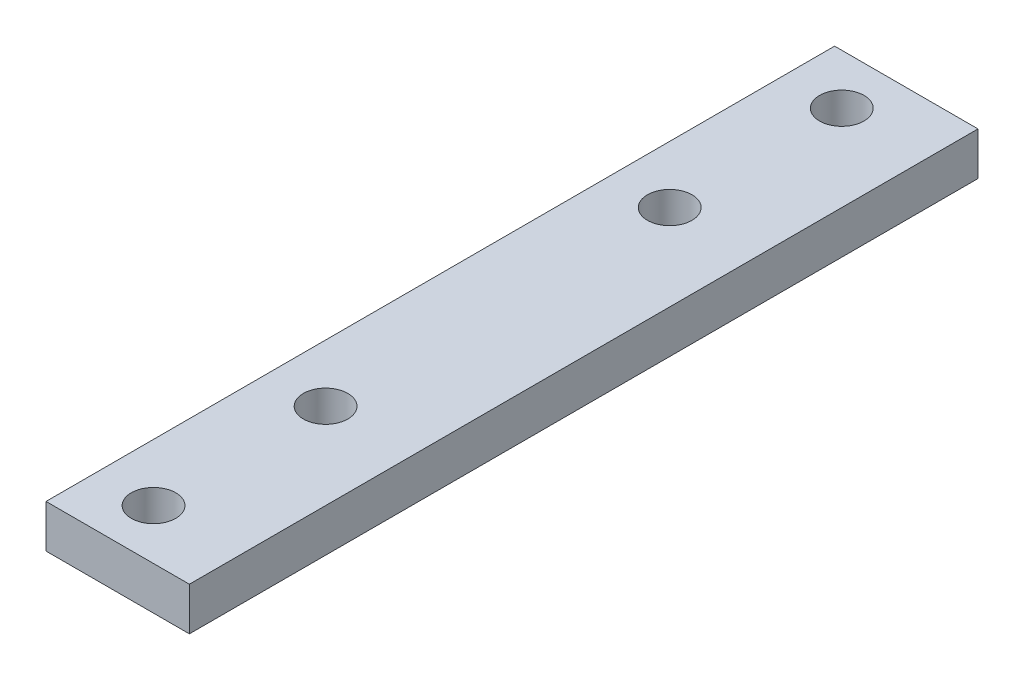
ISO-10303-21;
HEADER;
FILE_DESCRIPTION(('STEP AP214'),'2;1');
FILE_NAME('part.step','',(''),(''),'','','');
FILE_SCHEMA(('AUTOMOTIVE_DESIGN { 1 0 10303 214 1 1 1 1 }'));
ENDSEC;
DATA;
#1=APPLICATION_CONTEXT('core data for automotive mechanical design processes');
#2=APPLICATION_PROTOCOL_DEFINITION('international standard','automotive_design',2000,#1);
#3=PRODUCT_CONTEXT('',#1,'mechanical');
#4=PRODUCT('Part','Part','',(#3));
#5=PRODUCT_RELATED_PRODUCT_CATEGORY('part','',(#4));
#6=PRODUCT_DEFINITION_FORMATION('','',#4);
#7=PRODUCT_DEFINITION_CONTEXT('part definition',#1,'design');
#8=PRODUCT_DEFINITION('design','',#6,#7);
#9=PRODUCT_DEFINITION_SHAPE('','',#8);
#10=(LENGTH_UNIT() NAMED_UNIT(*) SI_UNIT(.MILLI.,.METRE.));
#11=(NAMED_UNIT(*) PLANE_ANGLE_UNIT() SI_UNIT($,.RADIAN.));
#12=(NAMED_UNIT(*) SI_UNIT($,.STERADIAN.) SOLID_ANGLE_UNIT());
#13=UNCERTAINTY_MEASURE_WITH_UNIT(LENGTH_MEASURE(1.E-05),#10,'distance_accuracy_value','');
#14=(GEOMETRIC_REPRESENTATION_CONTEXT(3) GLOBAL_UNCERTAINTY_ASSIGNED_CONTEXT((#13)) GLOBAL_UNIT_ASSIGNED_CONTEXT((#10,
#11,#12)) REPRESENTATION_CONTEXT('',''));
#15=CARTESIAN_POINT('',(0.,0.,0.));
#16=DIRECTION('',(0.,0.,1.));
#17=DIRECTION('',(1.,0.,0.));
#18=AXIS2_PLACEMENT_3D('',#15,#16,#17);
#19=CARTESIAN_POINT('',(-30.,0.,45.));
#20=DIRECTION('',(1.,0.,0.));
#21=DIRECTION('',(0.,1.,0.));
#22=AXIS2_PLACEMENT_3D('',#19,#20,#21);
#23=PLANE('',#22);
#24=DIRECTION('',(0.,1.,0.));
#25=VECTOR('',#24,1.);
#26=CARTESIAN_POINT('',(-30.,0.,-5.));
#27=LINE('',#26,#25);
#28=CARTESIAN_POINT('',(-30.,0.,-5.));
#29=VERTEX_POINT('',#28);
#30=CARTESIAN_POINT('',(-30.,3.,-5.));
#31=VERTEX_POINT('',#30);
#32=EDGE_CURVE('E11',#29,#31,#27,.T.);
#33=ORIENTED_EDGE('',*,*,#32,.F.);
#34=DIRECTION('',(0.,0.,-1.));
#35=VECTOR('',#34,1.);
#36=CARTESIAN_POINT('',(-30.,0.,0.));
#37=LINE('',#36,#35);
#38=CARTESIAN_POINT('',(-30.,0.,50.));
#39=VERTEX_POINT('',#38);
#40=EDGE_CURVE('E91',#39,#29,#37,.T.);
#41=ORIENTED_EDGE('',*,*,#40,.F.);
#42=DIRECTION('',(0.,1.,0.));
#43=VECTOR('',#42,1.);
#44=CARTESIAN_POINT('',(-30.,0.,50.));
#45=LINE('',#44,#43);
#46=CARTESIAN_POINT('',(-30.,3.,50.));
#47=VERTEX_POINT('',#46);
#48=EDGE_CURVE('E55',#39,#47,#45,.T.);
#49=ORIENTED_EDGE('',*,*,#48,.T.);
#50=DIRECTION('',(0.,0.,1.));
#51=VECTOR('',#50,1.);
#52=CARTESIAN_POINT('',(-30.,3.,-5.));
#53=LINE('',#52,#51);
#54=EDGE_CURVE('E107',#31,#47,#53,.T.);
#55=ORIENTED_EDGE('',*,*,#54,.F.);
#56=EDGE_LOOP('',(#33,#41,#49,#55));
#57=FACE_BOUND('',#56,.T.);
#58=ADVANCED_FACE('F47',(#57),#23,.F.);
#59=CARTESIAN_POINT('',(0.,0.,-5.));
#60=DIRECTION('',(0.,0.,-1.));
#61=DIRECTION('',(-1.,0.,0.));
#62=AXIS2_PLACEMENT_3D('',#59,#60,#61);
#63=PLANE('',#62);
#64=DIRECTION('',(0.,-1.,0.));
#65=VECTOR('',#64,1.);
#66=CARTESIAN_POINT('',(-20.,3.,-5.));
#67=LINE('',#66,#65);
#68=CARTESIAN_POINT('',(-20.,3.,-5.));
#69=VERTEX_POINT('',#68);
#70=CARTESIAN_POINT('',(-20.,0.,-5.));
#71=VERTEX_POINT('',#70);
#72=EDGE_CURVE('E120',#69,#71,#67,.T.);
#73=ORIENTED_EDGE('',*,*,#72,.T.);
#74=DIRECTION('',(1.,0.,0.));
#75=VECTOR('',#74,1.);
#76=CARTESIAN_POINT('',(-30.,0.,-5.));
#77=LINE('',#76,#75);
#78=EDGE_CURVE('E100',#29,#71,#77,.T.);
#79=ORIENTED_EDGE('',*,*,#78,.F.);
#80=ORIENTED_EDGE('',*,*,#32,.T.);
#81=DIRECTION('',(-1.,0.,0.));
#82=VECTOR('',#81,1.);
#83=CARTESIAN_POINT('',(-30.,3.,-5.));
#84=LINE('',#83,#82);
#85=EDGE_CURVE('E117',#69,#31,#84,.T.);
#86=ORIENTED_EDGE('',*,*,#85,.F.);
#87=EDGE_LOOP('',(#73,#79,#80,#86));
#88=FACE_BOUND('',#87,.T.);
#89=ADVANCED_FACE('F162',(#88),#63,.T.);
#90=CARTESIAN_POINT('',(0.,0.,50.));
#91=DIRECTION('',(0.,0.,1.));
#92=DIRECTION('',(-1.,0.,0.));
#93=AXIS2_PLACEMENT_3D('',#90,#91,#92);
#94=PLANE('',#93);
#95=ORIENTED_EDGE('',*,*,#48,.F.);
#96=DIRECTION('',(1.,0.,0.));
#97=VECTOR('',#96,1.);
#98=CARTESIAN_POINT('',(-30.,0.,50.));
#99=LINE('',#98,#97);
#100=CARTESIAN_POINT('',(-20.,0.,50.));
#101=VERTEX_POINT('',#100);
#102=EDGE_CURVE('E88',#39,#101,#99,.T.);
#103=ORIENTED_EDGE('',*,*,#102,.T.);
#104=DIRECTION('',(0.,-1.,0.));
#105=VECTOR('',#104,1.);
#106=CARTESIAN_POINT('',(-20.,3.,50.));
#107=LINE('',#106,#105);
#108=CARTESIAN_POINT('',(-20.,3.,50.));
#109=VERTEX_POINT('',#108);
#110=EDGE_CURVE('E125',#109,#101,#107,.T.);
#111=ORIENTED_EDGE('',*,*,#110,.F.);
#112=DIRECTION('',(1.,0.,0.));
#113=VECTOR('',#112,1.);
#114=CARTESIAN_POINT('',(-30.,3.,50.));
#115=LINE('',#114,#113);
#116=EDGE_CURVE('E103',#47,#109,#115,.T.);
#117=ORIENTED_EDGE('',*,*,#116,.F.);
#118=EDGE_LOOP('',(#95,#103,#111,#117));
#119=FACE_BOUND('',#118,.T.);
#120=ADVANCED_FACE('F102',(#119),#94,.T.);
#121=CARTESIAN_POINT('',(-26.,-2.,-1.49999999999999));
#122=DIRECTION('',(0.,1.,0.));
#123=DIRECTION('',(0.,0.,1.));
#124=AXIS2_PLACEMENT_3D('',#121,#122,#123);
#125=CYLINDRICAL_SURFACE('',#124,1.55);
#126=CARTESIAN_POINT('',(-26.,3.,-1.49999999999999));
#127=DIRECTION('',(0.,1.,0.));
#128=DIRECTION('',(0.,0.,-1.));
#129=AXIS2_PLACEMENT_3D('',#126,#127,#128);
#130=CIRCLE('',#129,1.55);
#131=CARTESIAN_POINT('',(-26.,3.,-3.04999999999999));
#132=VERTEX_POINT('',#131);
#133=EDGE_CURVE('E133',#132,#132,#130,.T.);
#134=ORIENTED_EDGE('',*,*,#133,.T.);
#135=EDGE_LOOP('',(#134));
#136=FACE_BOUND('',#135,.T.);
#137=CARTESIAN_POINT('',(-26.,0.,-1.49999999999999));
#138=DIRECTION('',(0.,-1.,0.));
#139=DIRECTION('',(0.,0.,-1.));
#140=AXIS2_PLACEMENT_3D('',#137,#138,#139);
#141=CIRCLE('',#140,1.55);
#142=CARTESIAN_POINT('',(-26.,0.,-3.04999999999999));
#143=VERTEX_POINT('',#142);
#144=EDGE_CURVE('E138',#143,#143,#141,.F.);
#145=ORIENTED_EDGE('',*,*,#144,.F.);
#146=EDGE_LOOP('',(#145));
#147=FACE_BOUND('',#146,.T.);
#148=ADVANCED_FACE('F189',(#136,#147),#125,.F.);
#149=CARTESIAN_POINT('',(-26.,-2.,46.5));
#150=DIRECTION('',(0.,1.,0.));
#151=DIRECTION('',(0.,0.,1.));
#152=AXIS2_PLACEMENT_3D('',#149,#150,#151);
#153=CYLINDRICAL_SURFACE('',#152,1.55);
#154=CARTESIAN_POINT('',(-26.,3.,46.5));
#155=DIRECTION('',(0.,1.,0.));
#156=DIRECTION('',(0.,0.,1.));
#157=AXIS2_PLACEMENT_3D('',#154,#155,#156);
#158=CIRCLE('',#157,1.55);
#159=CARTESIAN_POINT('',(-26.,3.,48.05));
#160=VERTEX_POINT('',#159);
#161=EDGE_CURVE('E137',#160,#160,#158,.T.);
#162=ORIENTED_EDGE('',*,*,#161,.T.);
#163=EDGE_LOOP('',(#162));
#164=FACE_BOUND('',#163,.T.);
#165=CARTESIAN_POINT('',(-26.,0.,46.5));
#166=DIRECTION('',(0.,-1.,0.));
#167=DIRECTION('',(0.,0.,-1.));
#168=AXIS2_PLACEMENT_3D('',#165,#166,#167);
#169=CIRCLE('',#168,1.55);
#170=CARTESIAN_POINT('',(-26.,0.,44.95));
#171=VERTEX_POINT('',#170);
#172=EDGE_CURVE('E96',#171,#171,#169,.F.);
#173=ORIENTED_EDGE('',*,*,#172,.F.);
#174=EDGE_LOOP('',(#173));
#175=FACE_BOUND('',#174,.T.);
#176=ADVANCED_FACE('F193',(#164,#175),#153,.F.);
#177=CARTESIAN_POINT('',(-25.9999999999999,-2.,34.5));
#178=DIRECTION('',(0.,1.,0.));
#179=DIRECTION('',(0.,0.,1.));
#180=AXIS2_PLACEMENT_3D('',#177,#178,#179);
#181=CYLINDRICAL_SURFACE('',#180,1.55);
#182=CARTESIAN_POINT('',(-25.9999999999999,3.,34.5));
#183=DIRECTION('',(0.,1.,0.));
#184=DIRECTION('',(0.,0.,1.));
#185=AXIS2_PLACEMENT_3D('',#182,#183,#184);
#186=CIRCLE('',#185,1.55);
#187=CARTESIAN_POINT('',(-25.9999999999999,3.,36.05));
#188=VERTEX_POINT('',#187);
#189=EDGE_CURVE('E132',#188,#188,#186,.T.);
#190=ORIENTED_EDGE('',*,*,#189,.T.);
#191=EDGE_LOOP('',(#190));
#192=FACE_BOUND('',#191,.T.);
#193=CARTESIAN_POINT('',(-25.9999999999999,0.,34.5));
#194=DIRECTION('',(0.,-1.,0.));
#195=DIRECTION('',(0.,0.,-1.));
#196=AXIS2_PLACEMENT_3D('',#193,#194,#195);
#197=CIRCLE('',#196,1.55);
#198=CARTESIAN_POINT('',(-25.9999999999999,0.,32.95));
#199=VERTEX_POINT('',#198);
#200=EDGE_CURVE('E152',#199,#199,#197,.F.);
#201=ORIENTED_EDGE('',*,*,#200,.F.);
#202=EDGE_LOOP('',(#201));
#203=FACE_BOUND('',#202,.T.);
#204=ADVANCED_FACE('F199',(#192,#203),#181,.F.);
#205=CARTESIAN_POINT('',(-25.9999999999999,-2.,10.5));
#206=DIRECTION('',(0.,1.,0.));
#207=DIRECTION('',(0.,0.,1.));
#208=AXIS2_PLACEMENT_3D('',#205,#206,#207);
#209=CYLINDRICAL_SURFACE('',#208,1.55);
#210=CARTESIAN_POINT('',(-25.9999999999999,3.,10.5));
#211=DIRECTION('',(0.,1.,0.));
#212=DIRECTION('',(0.,0.,-1.));
#213=AXIS2_PLACEMENT_3D('',#210,#211,#212);
#214=CIRCLE('',#213,1.55);
#215=CARTESIAN_POINT('',(-25.9999999999999,3.,8.95));
#216=VERTEX_POINT('',#215);
#217=EDGE_CURVE('E128',#216,#216,#214,.T.);
#218=ORIENTED_EDGE('',*,*,#217,.T.);
#219=EDGE_LOOP('',(#218));
#220=FACE_BOUND('',#219,.T.);
#221=CARTESIAN_POINT('',(-25.9999999999999,0.,10.5));
#222=DIRECTION('',(0.,-1.,0.));
#223=DIRECTION('',(0.,0.,-1.));
#224=AXIS2_PLACEMENT_3D('',#221,#222,#223);
#225=CIRCLE('',#224,1.55);
#226=CARTESIAN_POINT('',(-25.9999999999999,0.,8.95));
#227=VERTEX_POINT('',#226);
#228=EDGE_CURVE('E148',#227,#227,#225,.F.);
#229=ORIENTED_EDGE('',*,*,#228,.F.);
#230=EDGE_LOOP('',(#229));
#231=FACE_BOUND('',#230,.T.);
#232=ADVANCED_FACE('F177',(#220,#231),#209,.F.);
#233=CARTESIAN_POINT('',(-20.,3.,-5.));
#234=DIRECTION('',(-1.,0.,0.));
#235=DIRECTION('',(0.,0.,1.));
#236=AXIS2_PLACEMENT_3D('',#233,#234,#235);
#237=PLANE('',#236);
#238=DIRECTION('',(0.,0.,-1.));
#239=VECTOR('',#238,1.);
#240=CARTESIAN_POINT('',(-20.,0.,-5.));
#241=LINE('',#240,#239);
#242=EDGE_CURVE('E62',#101,#71,#241,.T.);
#243=ORIENTED_EDGE('',*,*,#242,.T.);
#244=ORIENTED_EDGE('',*,*,#72,.F.);
#245=DIRECTION('',(0.,0.,-1.));
#246=VECTOR('',#245,1.);
#247=CARTESIAN_POINT('',(-20.,3.,-5.));
#248=LINE('',#247,#246);
#249=EDGE_CURVE('E114',#109,#69,#248,.T.);
#250=ORIENTED_EDGE('',*,*,#249,.F.);
#251=ORIENTED_EDGE('',*,*,#110,.T.);
#252=EDGE_LOOP('',(#243,#244,#250,#251));
#253=FACE_BOUND('',#252,.T.);
#254=ADVANCED_FACE('F164',(#253),#237,.F.);
#255=CARTESIAN_POINT('',(0.,3.,0.));
#256=DIRECTION('',(0.,1.,0.));
#257=DIRECTION('',(0.,0.,1.));
#258=AXIS2_PLACEMENT_3D('',#255,#256,#257);
#259=PLANE('',#258);
#260=ORIENTED_EDGE('',*,*,#217,.F.);
#261=EDGE_LOOP('',(#260));
#262=FACE_BOUND('',#261,.T.);
#263=ORIENTED_EDGE('',*,*,#189,.F.);
#264=EDGE_LOOP('',(#263));
#265=FACE_BOUND('',#264,.T.);
#266=ORIENTED_EDGE('',*,*,#161,.F.);
#267=EDGE_LOOP('',(#266));
#268=FACE_BOUND('',#267,.T.);
#269=ORIENTED_EDGE('',*,*,#133,.F.);
#270=EDGE_LOOP('',(#269));
#271=FACE_BOUND('',#270,.T.);
#272=ORIENTED_EDGE('',*,*,#54,.T.);
#273=ORIENTED_EDGE('',*,*,#116,.T.);
#274=ORIENTED_EDGE('',*,*,#249,.T.);
#275=ORIENTED_EDGE('',*,*,#85,.T.);
#276=EDGE_LOOP('',(#272,#273,#274,#275));
#277=FACE_BOUND('',#276,.T.);
#278=ADVANCED_FACE('F166',(#262,#265,#268,#271,#277),#259,.T.);
#279=CARTESIAN_POINT('',(-30.,0.,0.));
#280=DIRECTION('',(0.,-1.,0.));
#281=DIRECTION('',(0.,0.,-1.));
#282=AXIS2_PLACEMENT_3D('',#279,#280,#281);
#283=PLANE('',#282);
#284=ORIENTED_EDGE('',*,*,#172,.T.);
#285=EDGE_LOOP('',(#284));
#286=FACE_BOUND('',#285,.T.);
#287=ORIENTED_EDGE('',*,*,#242,.F.);
#288=ORIENTED_EDGE('',*,*,#102,.F.);
#289=ORIENTED_EDGE('',*,*,#40,.T.);
#290=ORIENTED_EDGE('',*,*,#78,.T.);
#291=EDGE_LOOP('',(#287,#288,#289,#290));
#292=FACE_BOUND('',#291,.T.);
#293=ORIENTED_EDGE('',*,*,#200,.T.);
#294=EDGE_LOOP('',(#293));
#295=FACE_BOUND('',#294,.T.);
#296=ORIENTED_EDGE('',*,*,#228,.T.);
#297=EDGE_LOOP('',(#296));
#298=FACE_BOUND('',#297,.T.);
#299=ORIENTED_EDGE('',*,*,#144,.T.);
#300=EDGE_LOOP('',(#299));
#301=FACE_BOUND('',#300,.T.);
#302=ADVANCED_FACE('F89',(#286,#292,#295,#298,#301),#283,.T.);
#303=CLOSED_SHELL('',(#58,#89,#120,#148,#176,#204,#232,#254,#278,#302));
#304=MANIFOLD_SOLID_BREP('B2',#303);
#305=ADVANCED_BREP_SHAPE_REPRESENTATION('',(#18,#304),#14);
#306=SHAPE_DEFINITION_REPRESENTATION(#9,#305);
ENDSEC;
END-ISO-10303-21;
